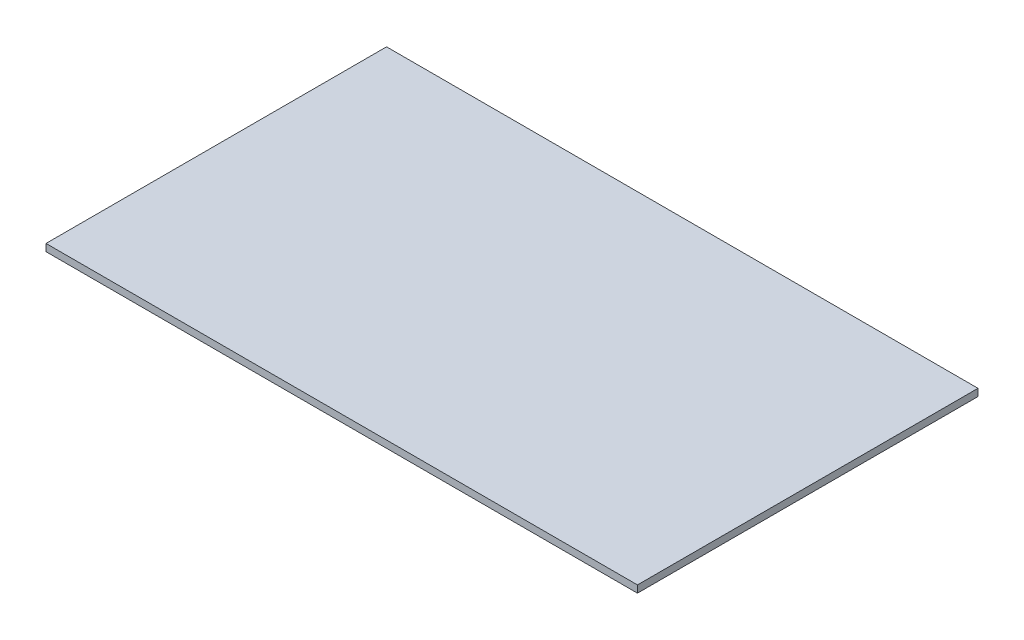
ISO-10303-21;
HEADER;
FILE_DESCRIPTION(('STEP AP214'),'2;1');
FILE_NAME('part.step','',(''),(''),'','','');
FILE_SCHEMA(('AUTOMOTIVE_DESIGN { 1 0 10303 214 1 1 1 1 }'));
ENDSEC;
DATA;
#1=APPLICATION_CONTEXT('core data for automotive mechanical design processes');
#2=APPLICATION_PROTOCOL_DEFINITION('international standard','automotive_design',2000,#1);
#3=PRODUCT_CONTEXT('',#1,'mechanical');
#4=PRODUCT('Part','Part','',(#3));
#5=PRODUCT_RELATED_PRODUCT_CATEGORY('part','',(#4));
#6=PRODUCT_DEFINITION_FORMATION('','',#4);
#7=PRODUCT_DEFINITION_CONTEXT('part definition',#1,'design');
#8=PRODUCT_DEFINITION('design','',#6,#7);
#9=PRODUCT_DEFINITION_SHAPE('','',#8);
#10=(LENGTH_UNIT() NAMED_UNIT(*) SI_UNIT(.MILLI.,.METRE.));
#11=(NAMED_UNIT(*) PLANE_ANGLE_UNIT() SI_UNIT($,.RADIAN.));
#12=(NAMED_UNIT(*) SI_UNIT($,.STERADIAN.) SOLID_ANGLE_UNIT());
#13=UNCERTAINTY_MEASURE_WITH_UNIT(LENGTH_MEASURE(1.E-05),#10,'distance_accuracy_value','');
#14=(GEOMETRIC_REPRESENTATION_CONTEXT(3) GLOBAL_UNCERTAINTY_ASSIGNED_CONTEXT((#13)) GLOBAL_UNIT_ASSIGNED_CONTEXT((#10,
#11,#12)) REPRESENTATION_CONTEXT('',''));
#15=CARTESIAN_POINT('',(0.,0.,0.));
#16=DIRECTION('',(0.,0.,1.));
#17=DIRECTION('',(1.,0.,0.));
#18=AXIS2_PLACEMENT_3D('',#15,#16,#17);
#19=CARTESIAN_POINT('',(0.,1.,0.));
#20=DIRECTION('',(1.,0.,0.));
#21=DIRECTION('',(0.,0.,-1.));
#22=AXIS2_PLACEMENT_3D('',#19,#20,#21);
#23=PLANE('',#22);
#24=DIRECTION('',(0.,0.,1.));
#25=VECTOR('',#24,1.);
#26=CARTESIAN_POINT('',(0.,0.,0.));
#27=LINE('',#26,#25);
#28=CARTESIAN_POINT('',(0.,0.,0.));
#29=VERTEX_POINT('',#28);
#30=CARTESIAN_POINT('',(0.,0.,47.5));
#31=VERTEX_POINT('',#30);
#32=EDGE_CURVE('E115',#29,#31,#27,.T.);
#33=ORIENTED_EDGE('',*,*,#32,.T.);
#34=DIRECTION('',(0.,-1.,0.));
#35=VECTOR('',#34,1.);
#36=CARTESIAN_POINT('',(0.,1.,47.5));
#37=LINE('',#36,#35);
#38=CARTESIAN_POINT('',(0.,1.,47.5));
#39=VERTEX_POINT('',#38);
#40=EDGE_CURVE('E11',#39,#31,#37,.T.);
#41=ORIENTED_EDGE('',*,*,#40,.F.);
#42=DIRECTION('',(0.,0.,1.));
#43=VECTOR('',#42,1.);
#44=CARTESIAN_POINT('',(0.,1.,0.));
#45=LINE('',#44,#43);
#46=CARTESIAN_POINT('',(0.,1.,0.));
#47=VERTEX_POINT('',#46);
#48=EDGE_CURVE('E97',#47,#39,#45,.T.);
#49=ORIENTED_EDGE('',*,*,#48,.F.);
#50=DIRECTION('',(0.,-1.,0.));
#51=VECTOR('',#50,1.);
#52=CARTESIAN_POINT('',(0.,1.,0.));
#53=LINE('',#52,#51);
#54=EDGE_CURVE('E64',#47,#29,#53,.T.);
#55=ORIENTED_EDGE('',*,*,#54,.T.);
#56=EDGE_LOOP('',(#33,#41,#49,#55));
#57=FACE_BOUND('',#56,.T.);
#58=ADVANCED_FACE('F47',(#57),#23,.F.);
#59=CARTESIAN_POINT('',(0.,1.,47.5));
#60=DIRECTION('',(0.,0.,-1.));
#61=DIRECTION('',(-1.,0.,0.));
#62=AXIS2_PLACEMENT_3D('',#59,#60,#61);
#63=PLANE('',#62);
#64=DIRECTION('',(1.,0.,0.));
#65=VECTOR('',#64,1.);
#66=CARTESIAN_POINT('',(0.,0.,47.5));
#67=LINE('',#66,#65);
#68=CARTESIAN_POINT('',(82.5,0.,47.5));
#69=VERTEX_POINT('',#68);
#70=EDGE_CURVE('E103',#31,#69,#67,.T.);
#71=ORIENTED_EDGE('',*,*,#70,.T.);
#72=DIRECTION('',(0.,-1.,0.));
#73=VECTOR('',#72,1.);
#74=CARTESIAN_POINT('',(82.5,1.,47.5));
#75=LINE('',#74,#73);
#76=CARTESIAN_POINT('',(82.5,1.,47.5));
#77=VERTEX_POINT('',#76);
#78=EDGE_CURVE('E56',#77,#69,#75,.T.);
#79=ORIENTED_EDGE('',*,*,#78,.F.);
#80=DIRECTION('',(1.,0.,0.));
#81=VECTOR('',#80,1.);
#82=CARTESIAN_POINT('',(0.,1.,47.5));
#83=LINE('',#82,#81);
#84=EDGE_CURVE('E89',#39,#77,#83,.T.);
#85=ORIENTED_EDGE('',*,*,#84,.F.);
#86=ORIENTED_EDGE('',*,*,#40,.T.);
#87=EDGE_LOOP('',(#71,#79,#85,#86));
#88=FACE_BOUND('',#87,.T.);
#89=ADVANCED_FACE('F102',(#88),#63,.F.);
#90=CARTESIAN_POINT('',(82.5,1.,0.));
#91=DIRECTION('',(1.,0.,0.));
#92=DIRECTION('',(0.,0.,-1.));
#93=AXIS2_PLACEMENT_3D('',#90,#91,#92);
#94=PLANE('',#93);
#95=DIRECTION('',(0.,0.,1.));
#96=VECTOR('',#95,1.);
#97=CARTESIAN_POINT('',(82.5,0.,0.));
#98=LINE('',#97,#96);
#99=CARTESIAN_POINT('',(82.5,0.,0.));
#100=VERTEX_POINT('',#99);
#101=EDGE_CURVE('E120',#100,#69,#98,.T.);
#102=ORIENTED_EDGE('',*,*,#101,.F.);
#103=DIRECTION('',(0.,-1.,0.));
#104=VECTOR('',#103,1.);
#105=CARTESIAN_POINT('',(82.5,1.,0.));
#106=LINE('',#105,#104);
#107=CARTESIAN_POINT('',(82.5,1.,0.));
#108=VERTEX_POINT('',#107);
#109=EDGE_CURVE('E78',#108,#100,#106,.T.);
#110=ORIENTED_EDGE('',*,*,#109,.F.);
#111=DIRECTION('',(0.,0.,1.));
#112=VECTOR('',#111,1.);
#113=CARTESIAN_POINT('',(82.5,1.,0.));
#114=LINE('',#113,#112);
#115=EDGE_CURVE('E96',#108,#77,#114,.T.);
#116=ORIENTED_EDGE('',*,*,#115,.T.);
#117=ORIENTED_EDGE('',*,*,#78,.T.);
#118=EDGE_LOOP('',(#102,#110,#116,#117));
#119=FACE_BOUND('',#118,.T.);
#120=ADVANCED_FACE('F107',(#119),#94,.T.);
#121=CARTESIAN_POINT('',(0.,1.,0.));
#122=DIRECTION('',(0.,0.,-1.));
#123=DIRECTION('',(-1.,0.,0.));
#124=AXIS2_PLACEMENT_3D('',#121,#122,#123);
#125=PLANE('',#124);
#126=DIRECTION('',(1.,0.,0.));
#127=VECTOR('',#126,1.);
#128=CARTESIAN_POINT('',(0.,0.,0.));
#129=LINE('',#128,#127);
#130=EDGE_CURVE('E123',#29,#100,#129,.T.);
#131=ORIENTED_EDGE('',*,*,#130,.F.);
#132=ORIENTED_EDGE('',*,*,#54,.F.);
#133=DIRECTION('',(1.,0.,0.));
#134=VECTOR('',#133,1.);
#135=CARTESIAN_POINT('',(0.,1.,0.));
#136=LINE('',#135,#134);
#137=EDGE_CURVE('E109',#47,#108,#136,.T.);
#138=ORIENTED_EDGE('',*,*,#137,.T.);
#139=ORIENTED_EDGE('',*,*,#109,.T.);
#140=EDGE_LOOP('',(#131,#132,#138,#139));
#141=FACE_BOUND('',#140,.T.);
#142=ADVANCED_FACE('F133',(#141),#125,.T.);
#143=CARTESIAN_POINT('',(0.,1.,0.));
#144=DIRECTION('',(0.,1.,0.));
#145=DIRECTION('',(0.,0.,1.));
#146=AXIS2_PLACEMENT_3D('',#143,#144,#145);
#147=PLANE('',#146);
#148=ORIENTED_EDGE('',*,*,#48,.T.);
#149=ORIENTED_EDGE('',*,*,#84,.T.);
#150=ORIENTED_EDGE('',*,*,#115,.F.);
#151=ORIENTED_EDGE('',*,*,#137,.F.);
#152=EDGE_LOOP('',(#148,#149,#150,#151));
#153=FACE_BOUND('',#152,.T.);
#154=ADVANCED_FACE('F93',(#153),#147,.T.);
#155=CARTESIAN_POINT('',(0.,0.,0.));
#156=DIRECTION('',(0.,1.,0.));
#157=DIRECTION('',(0.,0.,1.));
#158=AXIS2_PLACEMENT_3D('',#155,#156,#157);
#159=PLANE('',#158);
#160=ORIENTED_EDGE('',*,*,#32,.F.);
#161=ORIENTED_EDGE('',*,*,#130,.T.);
#162=ORIENTED_EDGE('',*,*,#101,.T.);
#163=ORIENTED_EDGE('',*,*,#70,.F.);
#164=EDGE_LOOP('',(#160,#161,#162,#163));
#165=FACE_BOUND('',#164,.T.);
#166=ADVANCED_FACE('F132',(#165),#159,.F.);
#167=CLOSED_SHELL('',(#58,#89,#120,#142,#154,#166));
#168=MANIFOLD_SOLID_BREP('B2',#167);
#169=ADVANCED_BREP_SHAPE_REPRESENTATION('',(#18,#168),#14);
#170=SHAPE_DEFINITION_REPRESENTATION(#9,#169);
ENDSEC;
END-ISO-10303-21;
